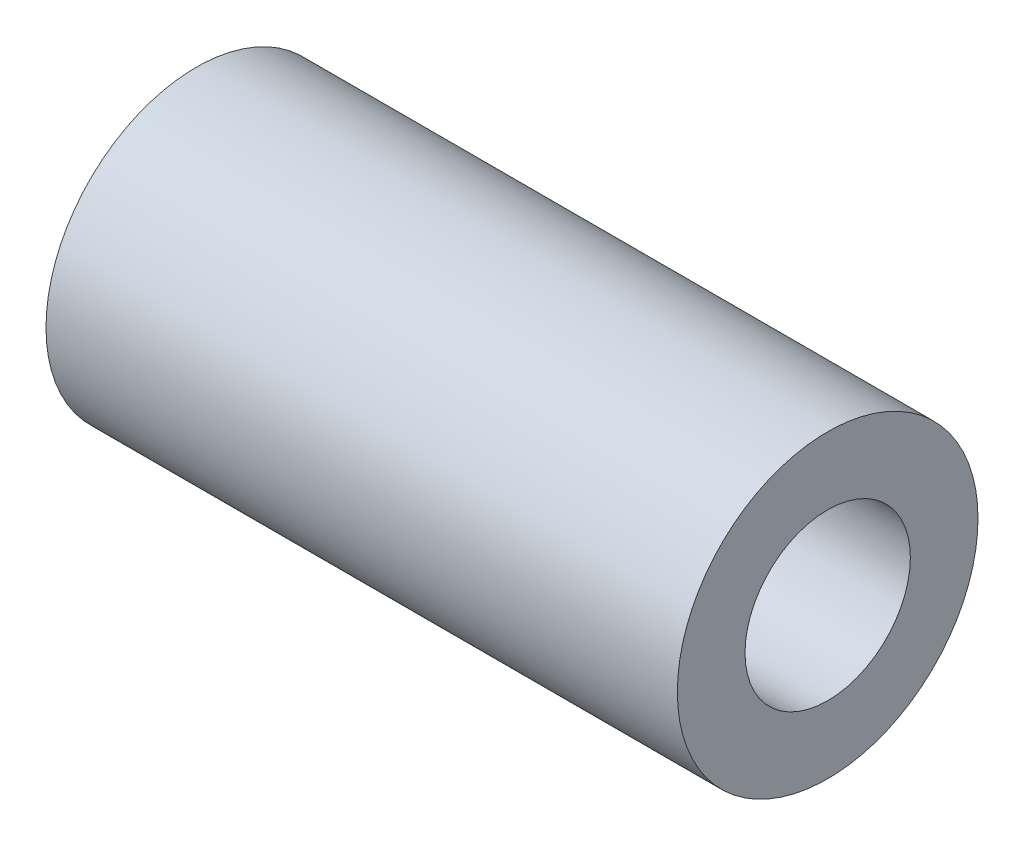
ISO-10303-21;
HEADER;
FILE_DESCRIPTION(('STEP AP214'),'2;1');
FILE_NAME('part.step','',(''),(''),'','','');
FILE_SCHEMA(('AUTOMOTIVE_DESIGN { 1 0 10303 214 1 1 1 1 }'));
ENDSEC;
DATA;
#1=APPLICATION_CONTEXT('core data for automotive mechanical design processes');
#2=APPLICATION_PROTOCOL_DEFINITION('international standard','automotive_design',2000,#1);
#3=PRODUCT_CONTEXT('',#1,'mechanical');
#4=PRODUCT('Part','Part','',(#3));
#5=PRODUCT_RELATED_PRODUCT_CATEGORY('part','',(#4));
#6=PRODUCT_DEFINITION_FORMATION('','',#4);
#7=PRODUCT_DEFINITION_CONTEXT('part definition',#1,'design');
#8=PRODUCT_DEFINITION('design','',#6,#7);
#9=PRODUCT_DEFINITION_SHAPE('','',#8);
#10=(LENGTH_UNIT() NAMED_UNIT(*) SI_UNIT(.MILLI.,.METRE.));
#11=(NAMED_UNIT(*) PLANE_ANGLE_UNIT() SI_UNIT($,.RADIAN.));
#12=(NAMED_UNIT(*) SI_UNIT($,.STERADIAN.) SOLID_ANGLE_UNIT());
#13=UNCERTAINTY_MEASURE_WITH_UNIT(LENGTH_MEASURE(1.E-05),#10,'distance_accuracy_value','');
#14=(GEOMETRIC_REPRESENTATION_CONTEXT(3) GLOBAL_UNCERTAINTY_ASSIGNED_CONTEXT((#13)) GLOBAL_UNIT_ASSIGNED_CONTEXT((#10,
#11,#12)) REPRESENTATION_CONTEXT('',''));
#15=CARTESIAN_POINT('',(0.,0.,0.));
#16=DIRECTION('',(0.,0.,1.));
#17=DIRECTION('',(1.,0.,0.));
#18=AXIS2_PLACEMENT_3D('',#15,#16,#17);
#19=CARTESIAN_POINT('',(21.,0.,0.));
#20=DIRECTION('',(1.,0.,0.));
#21=DIRECTION('',(0.,0.,-1.));
#22=AXIS2_PLACEMENT_3D('',#19,#20,#21);
#23=PLANE('',#22);
#24=CARTESIAN_POINT('',(21.,0.,0.));
#25=DIRECTION('',(1.,0.,0.));
#26=DIRECTION('',(0.,0.,-1.));
#27=AXIS2_PLACEMENT_3D('',#24,#25,#26);
#28=CIRCLE('',#27,5.);
#29=CARTESIAN_POINT('',(21.,0.,5.));
#30=VERTEX_POINT('',#29);
#31=EDGE_CURVE('E10',#30,#30,#28,.T.);
#32=ORIENTED_EDGE('',*,*,#31,.T.);
#33=EDGE_LOOP('',(#32));
#34=FACE_BOUND('',#33,.T.);
#35=CARTESIAN_POINT('',(21.,0.,0.));
#36=DIRECTION('',(1.,0.,0.));
#37=DIRECTION('',(0.,0.,-1.));
#38=AXIS2_PLACEMENT_3D('',#35,#36,#37);
#39=CIRCLE('',#38,2.75);
#40=CARTESIAN_POINT('',(21.,0.,2.75));
#41=VERTEX_POINT('',#40);
#42=EDGE_CURVE('E43',#41,#41,#39,.T.);
#43=ORIENTED_EDGE('',*,*,#42,.F.);
#44=EDGE_LOOP('',(#43));
#45=FACE_BOUND('',#44,.T.);
#46=ADVANCED_FACE('F32',(#34,#45),#23,.T.);
#47=CARTESIAN_POINT('',(0.,0.,0.));
#48=DIRECTION('',(1.,0.,0.));
#49=DIRECTION('',(0.,0.,-1.));
#50=AXIS2_PLACEMENT_3D('',#47,#48,#49);
#51=PLANE('',#50);
#52=CARTESIAN_POINT('',(0.,0.,0.));
#53=DIRECTION('',(1.,0.,0.));
#54=DIRECTION('',(0.,0.,-1.));
#55=AXIS2_PLACEMENT_3D('',#52,#53,#54);
#56=CIRCLE('',#55,5.);
#57=CARTESIAN_POINT('',(0.,0.,5.));
#58=VERTEX_POINT('',#57);
#59=EDGE_CURVE('E36',#58,#58,#56,.T.);
#60=ORIENTED_EDGE('',*,*,#59,.F.);
#61=EDGE_LOOP('',(#60));
#62=FACE_BOUND('',#61,.T.);
#63=CARTESIAN_POINT('',(0.,0.,0.));
#64=DIRECTION('',(1.,0.,0.));
#65=DIRECTION('',(0.,0.,-1.));
#66=AXIS2_PLACEMENT_3D('',#63,#64,#65);
#67=CIRCLE('',#66,2.75);
#68=CARTESIAN_POINT('',(0.,0.,2.75));
#69=VERTEX_POINT('',#68);
#70=EDGE_CURVE('E45',#69,#69,#67,.T.);
#71=ORIENTED_EDGE('',*,*,#70,.T.);
#72=EDGE_LOOP('',(#71));
#73=FACE_BOUND('',#72,.T.);
#74=ADVANCED_FACE('F55',(#62,#73),#51,.F.);
#75=CARTESIAN_POINT('',(21.,0.,0.));
#76=DIRECTION('',(-1.,0.,0.));
#77=DIRECTION('',(0.,0.,1.));
#78=AXIS2_PLACEMENT_3D('',#75,#76,#77);
#79=CYLINDRICAL_SURFACE('',#78,5.);
#80=CARTESIAN_POINT('',(21.,0.,5.));
#81=CARTESIAN_POINT('',(20.78125,0.,5.));
#82=CARTESIAN_POINT('',(20.5625,0.,5.));
#83=CARTESIAN_POINT('',(20.125,0.,5.));
#84=CARTESIAN_POINT('',(19.90625,0.,5.));
#85=CARTESIAN_POINT('',(19.46875,0.,5.));
#86=CARTESIAN_POINT('',(19.25,0.,5.));
#87=CARTESIAN_POINT('',(18.8125,0.,5.));
#88=CARTESIAN_POINT('',(18.59375,0.,5.));
#89=CARTESIAN_POINT('',(18.15625,0.,5.));
#90=CARTESIAN_POINT('',(17.9375,0.,5.));
#91=CARTESIAN_POINT('',(17.5,0.,5.));
#92=CARTESIAN_POINT('',(17.28125,0.,5.));
#93=CARTESIAN_POINT('',(16.84375,0.,5.));
#94=CARTESIAN_POINT('',(16.625,0.,5.));
#95=CARTESIAN_POINT('',(16.1875,0.,5.));
#96=CARTESIAN_POINT('',(15.96875,0.,5.));
#97=CARTESIAN_POINT('',(15.53125,0.,5.));
#98=CARTESIAN_POINT('',(15.3125,0.,5.));
#99=CARTESIAN_POINT('',(14.875,0.,5.));
#100=CARTESIAN_POINT('',(14.65625,0.,5.));
#101=CARTESIAN_POINT('',(14.21875,0.,5.));
#102=CARTESIAN_POINT('',(14.,0.,5.));
#103=CARTESIAN_POINT('',(13.5625,0.,5.));
#104=CARTESIAN_POINT('',(13.34375,0.,5.));
#105=CARTESIAN_POINT('',(12.90625,0.,5.));
#106=CARTESIAN_POINT('',(12.6875,0.,5.));
#107=CARTESIAN_POINT('',(12.25,0.,5.));
#108=CARTESIAN_POINT('',(12.03125,0.,5.));
#109=CARTESIAN_POINT('',(11.59375,0.,5.));
#110=CARTESIAN_POINT('',(11.375,0.,5.));
#111=CARTESIAN_POINT('',(10.9375,0.,5.));
#112=CARTESIAN_POINT('',(10.71875,0.,5.));
#113=CARTESIAN_POINT('',(10.28125,0.,5.));
#114=CARTESIAN_POINT('',(10.0625,0.,5.));
#115=CARTESIAN_POINT('',(9.625,0.,5.));
#116=CARTESIAN_POINT('',(9.40625,0.,5.));
#117=CARTESIAN_POINT('',(8.96875,0.,5.));
#118=CARTESIAN_POINT('',(8.75,0.,5.));
#119=CARTESIAN_POINT('',(8.3125,0.,5.));
#120=CARTESIAN_POINT('',(8.09375,0.,5.));
#121=CARTESIAN_POINT('',(7.65625,0.,5.));
#122=CARTESIAN_POINT('',(7.4375,0.,5.));
#123=CARTESIAN_POINT('',(7.,0.,5.));
#124=CARTESIAN_POINT('',(6.78125,0.,5.));
#125=CARTESIAN_POINT('',(6.34375,0.,5.));
#126=CARTESIAN_POINT('',(6.125,0.,5.));
#127=CARTESIAN_POINT('',(5.6875,0.,5.));
#128=CARTESIAN_POINT('',(5.46875,0.,5.));
#129=CARTESIAN_POINT('',(5.03125,0.,5.));
#130=CARTESIAN_POINT('',(4.8125,0.,5.));
#131=CARTESIAN_POINT('',(4.375,0.,5.));
#132=CARTESIAN_POINT('',(4.15625,0.,5.));
#133=CARTESIAN_POINT('',(3.71875,0.,5.));
#134=CARTESIAN_POINT('',(3.5,0.,5.));
#135=CARTESIAN_POINT('',(3.0625,0.,5.));
#136=CARTESIAN_POINT('',(2.84375,0.,5.));
#137=CARTESIAN_POINT('',(2.40625,0.,5.));
#138=CARTESIAN_POINT('',(2.1875,0.,5.));
#139=CARTESIAN_POINT('',(1.75,0.,5.));
#140=CARTESIAN_POINT('',(1.53125,0.,5.));
#141=CARTESIAN_POINT('',(1.09375,0.,5.));
#142=CARTESIAN_POINT('',(0.875000000000001,0.,5.));
#143=CARTESIAN_POINT('',(0.4375,0.,5.));
#144=CARTESIAN_POINT('',(0.21875,0.,5.));
#145=CARTESIAN_POINT('',(0.,0.,5.));
#146=B_SPLINE_CURVE_WITH_KNOTS('',3,(#80,#81,#82,#83,#84,#85,#86,#87,#88,#89,#90,#91,#92,#93,
#94,#95,#96,#97,#98,#99,#100,#101,#102,#103,#104,#105,#106,#107,#108,#109,#110,#111,#112,#113,
#114,#115,#116,#117,#118,#119,#120,#121,#122,#123,#124,#125,#126,#127,#128,#129,#130,#131,#132,
#133,#134,#135,#136,#137,#138,#139,#140,#141,#142,#143,#144,#145),.UNSPECIFIED.,.F.,.F.,(4,2,2,
2,2,2,2,2,2,2,2,2,2,2,2,2,2,2,2,2,2,2,2,2,2,2,2,2,2,2,2,2,4),(0.,0.656250000000001,1.3125,
1.96875,2.625,3.28125,3.9375,4.59375,5.25,5.90625,6.5625,7.21875,7.875,8.53125,9.1875,9.84375,
10.5,11.15625,11.8125,12.46875,13.125,13.78125,14.4375,15.09375,15.75,16.40625,17.0625,17.71875,
18.375,19.03125,19.6875,20.34375,21.),.UNSPECIFIED.);
#147=EDGE_CURVE('BSEAM34',#30,#58,#146,.T.);
#148=ORIENTED_EDGE('',*,*,#31,.F.);
#149=ORIENTED_EDGE('',*,*,#59,.T.);
#150=ORIENTED_EDGE('',*,*,#147,.T.);
#151=ORIENTED_EDGE('',*,*,#147,.F.);
#152=EDGE_LOOP('',(#148,#150,#149,#151));
#153=FACE_BOUND('',#152,.T.);
#154=ADVANCED_FACE('F34',(#153),#79,.T.);
#155=CARTESIAN_POINT('',(21.,0.,0.));
#156=DIRECTION('',(-1.,0.,0.));
#157=DIRECTION('',(0.,0.,1.));
#158=AXIS2_PLACEMENT_3D('',#155,#156,#157);
#159=CYLINDRICAL_SURFACE('',#158,2.75);
#160=CARTESIAN_POINT('',(21.,0.,2.75));
#161=CARTESIAN_POINT('',(20.78125,0.,2.75));
#162=CARTESIAN_POINT('',(20.5625,0.,2.75));
#163=CARTESIAN_POINT('',(20.125,0.,2.75));
#164=CARTESIAN_POINT('',(19.90625,0.,2.75));
#165=CARTESIAN_POINT('',(19.46875,0.,2.75));
#166=CARTESIAN_POINT('',(19.25,0.,2.75));
#167=CARTESIAN_POINT('',(18.8125,0.,2.75));
#168=CARTESIAN_POINT('',(18.59375,0.,2.75));
#169=CARTESIAN_POINT('',(18.15625,0.,2.75));
#170=CARTESIAN_POINT('',(17.9375,0.,2.75));
#171=CARTESIAN_POINT('',(17.5,0.,2.75));
#172=CARTESIAN_POINT('',(17.28125,0.,2.75));
#173=CARTESIAN_POINT('',(16.84375,0.,2.75));
#174=CARTESIAN_POINT('',(16.625,0.,2.75));
#175=CARTESIAN_POINT('',(16.1875,0.,2.75));
#176=CARTESIAN_POINT('',(15.96875,0.,2.75));
#177=CARTESIAN_POINT('',(15.53125,0.,2.75));
#178=CARTESIAN_POINT('',(15.3125,0.,2.75));
#179=CARTESIAN_POINT('',(14.875,0.,2.75));
#180=CARTESIAN_POINT('',(14.65625,0.,2.75));
#181=CARTESIAN_POINT('',(14.21875,0.,2.75));
#182=CARTESIAN_POINT('',(14.,0.,2.75));
#183=CARTESIAN_POINT('',(13.5625,0.,2.75));
#184=CARTESIAN_POINT('',(13.34375,0.,2.75));
#185=CARTESIAN_POINT('',(12.90625,0.,2.75));
#186=CARTESIAN_POINT('',(12.6875,0.,2.75));
#187=CARTESIAN_POINT('',(12.25,0.,2.75));
#188=CARTESIAN_POINT('',(12.03125,0.,2.75));
#189=CARTESIAN_POINT('',(11.59375,0.,2.75));
#190=CARTESIAN_POINT('',(11.375,0.,2.75));
#191=CARTESIAN_POINT('',(10.9375,0.,2.75));
#192=CARTESIAN_POINT('',(10.71875,0.,2.75));
#193=CARTESIAN_POINT('',(10.28125,0.,2.75));
#194=CARTESIAN_POINT('',(10.0625,0.,2.75));
#195=CARTESIAN_POINT('',(9.625,0.,2.75));
#196=CARTESIAN_POINT('',(9.40625,0.,2.75));
#197=CARTESIAN_POINT('',(8.96875,0.,2.75));
#198=CARTESIAN_POINT('',(8.75,0.,2.75));
#199=CARTESIAN_POINT('',(8.3125,0.,2.75));
#200=CARTESIAN_POINT('',(8.09375,0.,2.75));
#201=CARTESIAN_POINT('',(7.65625,0.,2.75));
#202=CARTESIAN_POINT('',(7.4375,0.,2.75));
#203=CARTESIAN_POINT('',(7.,0.,2.75));
#204=CARTESIAN_POINT('',(6.78125,0.,2.75));
#205=CARTESIAN_POINT('',(6.34375,0.,2.75));
#206=CARTESIAN_POINT('',(6.125,0.,2.75));
#207=CARTESIAN_POINT('',(5.6875,0.,2.75));
#208=CARTESIAN_POINT('',(5.46875,0.,2.75));
#209=CARTESIAN_POINT('',(5.03125,0.,2.75));
#210=CARTESIAN_POINT('',(4.8125,0.,2.75));
#211=CARTESIAN_POINT('',(4.375,0.,2.75));
#212=CARTESIAN_POINT('',(4.15625,0.,2.75));
#213=CARTESIAN_POINT('',(3.71875,0.,2.75));
#214=CARTESIAN_POINT('',(3.5,0.,2.75));
#215=CARTESIAN_POINT('',(3.0625,0.,2.75));
#216=CARTESIAN_POINT('',(2.84375,0.,2.75));
#217=CARTESIAN_POINT('',(2.40625,0.,2.75));
#218=CARTESIAN_POINT('',(2.1875,0.,2.75));
#219=CARTESIAN_POINT('',(1.75,0.,2.75));
#220=CARTESIAN_POINT('',(1.53125,0.,2.75));
#221=CARTESIAN_POINT('',(1.09375,0.,2.75));
#222=CARTESIAN_POINT('',(0.875000000000001,0.,2.75));
#223=CARTESIAN_POINT('',(0.4375,0.,2.75));
#224=CARTESIAN_POINT('',(0.21875,0.,2.75));
#225=CARTESIAN_POINT('',(0.,0.,2.75));
#226=B_SPLINE_CURVE_WITH_KNOTS('',3,(#160,#161,#162,#163,#164,#165,#166,#167,#168,#169,#170,
#171,#172,#173,#174,#175,#176,#177,#178,#179,#180,#181,#182,#183,#184,#185,#186,#187,#188,#189,
#190,#191,#192,#193,#194,#195,#196,#197,#198,#199,#200,#201,#202,#203,#204,#205,#206,#207,#208,
#209,#210,#211,#212,#213,#214,#215,#216,#217,#218,#219,#220,#221,#222,#223,#224,#225),
.UNSPECIFIED.,.F.,.F.,(4,2,2,2,2,2,2,2,2,2,2,2,2,2,2,2,2,2,2,2,2,2,2,2,2,2,2,2,2,2,2,2,4),(0.,
0.656250000000001,1.3125,1.96875,2.625,3.28125,3.9375,4.59375,5.25,5.90625,6.5625,7.21875,7.875,
8.53125,9.1875,9.84375,10.5,11.15625,11.8125,12.46875,13.125,13.78125,14.4375,15.09375,15.75,
16.40625,17.0625,17.71875,18.375,19.03125,19.6875,20.34375,21.),.UNSPECIFIED.);
#227=EDGE_CURVE('BSEAM51',#41,#69,#226,.T.);
#228=ORIENTED_EDGE('',*,*,#42,.T.);
#229=ORIENTED_EDGE('',*,*,#70,.F.);
#230=ORIENTED_EDGE('',*,*,#227,.T.);
#231=ORIENTED_EDGE('',*,*,#227,.F.);
#232=EDGE_LOOP('',(#228,#230,#229,#231));
#233=FACE_BOUND('',#232,.T.);
#234=ADVANCED_FACE('F51',(#233),#159,.F.);
#235=CLOSED_SHELL('',(#46,#74,#154,#234));
#236=MANIFOLD_SOLID_BREP('B2',#235);
#237=ADVANCED_BREP_SHAPE_REPRESENTATION('',(#18,#236),#14);
#238=SHAPE_DEFINITION_REPRESENTATION(#9,#237);
ENDSEC;
END-ISO-10303-21;
